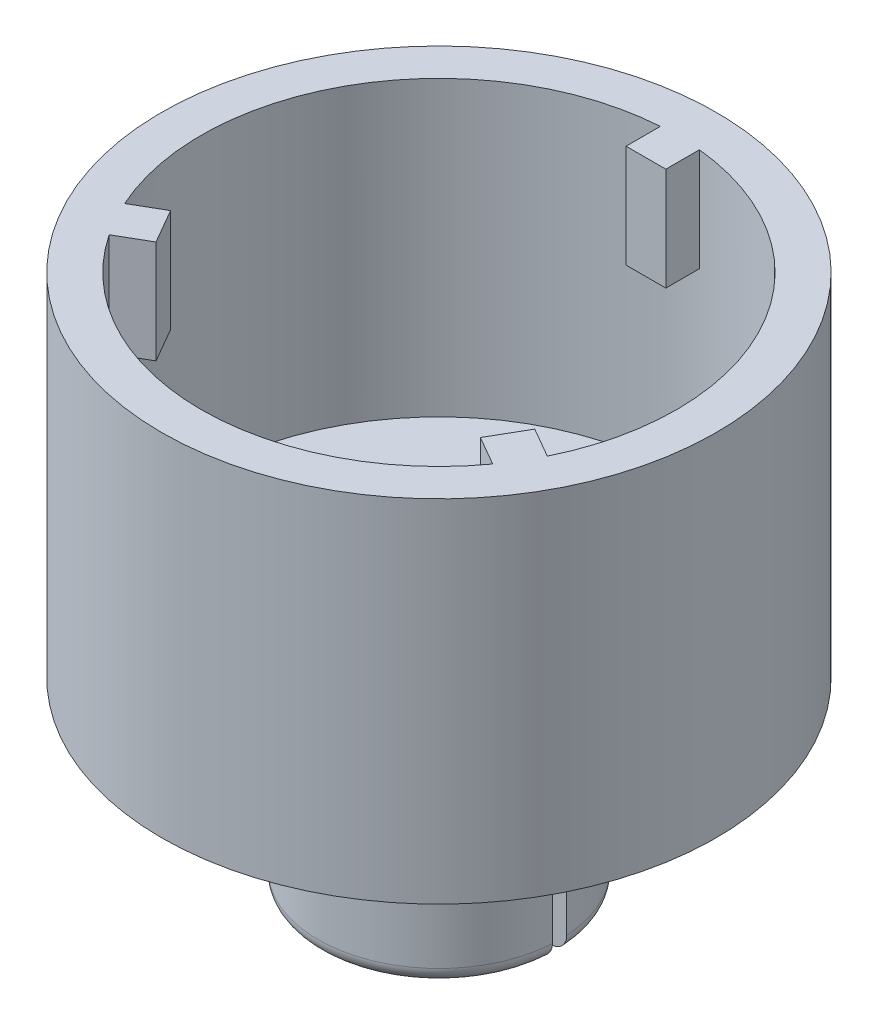
ISO-10303-21;
HEADER;
FILE_DESCRIPTION(('STEP AP214'),'2;1');
FILE_NAME('part.step','',(''),(''),'','','');
FILE_SCHEMA(('AUTOMOTIVE_DESIGN { 1 0 10303 214 1 1 1 1 }'));
ENDSEC;
DATA;
#1=APPLICATION_CONTEXT('core data for automotive mechanical design processes');
#2=APPLICATION_PROTOCOL_DEFINITION('international standard','automotive_design',2000,#1);
#3=PRODUCT_CONTEXT('',#1,'mechanical');
#4=PRODUCT('Part','Part','',(#3));
#5=PRODUCT_RELATED_PRODUCT_CATEGORY('part','',(#4));
#6=PRODUCT_DEFINITION_FORMATION('','',#4);
#7=PRODUCT_DEFINITION_CONTEXT('part definition',#1,'design');
#8=PRODUCT_DEFINITION('design','',#6,#7);
#9=PRODUCT_DEFINITION_SHAPE('','',#8);
#10=(LENGTH_UNIT() NAMED_UNIT(*) SI_UNIT(.MILLI.,.METRE.));
#11=(NAMED_UNIT(*) PLANE_ANGLE_UNIT() SI_UNIT($,.RADIAN.));
#12=(NAMED_UNIT(*) SI_UNIT($,.STERADIAN.) SOLID_ANGLE_UNIT());
#13=UNCERTAINTY_MEASURE_WITH_UNIT(LENGTH_MEASURE(1.E-05),#10,'distance_accuracy_value','');
#14=(GEOMETRIC_REPRESENTATION_CONTEXT(3) GLOBAL_UNCERTAINTY_ASSIGNED_CONTEXT((#13)) GLOBAL_UNIT_ASSIGNED_CONTEXT((#10,
#11,#12)) REPRESENTATION_CONTEXT('',''));
#15=CARTESIAN_POINT('',(0.,0.,0.));
#16=DIRECTION('',(0.,0.,1.));
#17=DIRECTION('',(1.,0.,0.));
#18=AXIS2_PLACEMENT_3D('',#15,#16,#17);
#19=CARTESIAN_POINT('',(0.,-23.,0.));
#20=DIRECTION('',(0.,1.,0.));
#21=DIRECTION('',(0.,0.,1.));
#22=AXIS2_PLACEMENT_3D('',#19,#20,#21);
#23=CYLINDRICAL_SURFACE('',#22,15.25);
#24=DIRECTION('',(0.,1.,0.));
#25=VECTOR('',#24,1.);
#26=CARTESIAN_POINT('',(-15.2232202518428,-23.,0.903363251346434));
#27=LINE('',#26,#25);
#28=CARTESIAN_POINT('',(-15.2232202518428,-7.,0.903363251346434));
#29=VERTEX_POINT('',#28);
#30=CARTESIAN_POINT('',(-15.2232202518428,-21.,0.903363251346434));
#31=VERTEX_POINT('',#30);
#32=EDGE_CURVE('E285',#29,#31,#27,.F.);
#33=ORIENTED_EDGE('',*,*,#32,.T.);
#34=CARTESIAN_POINT('',(0.,-21.,0.));
#35=DIRECTION('',(0.,-1.,0.));
#36=DIRECTION('',(0.,0.,-1.));
#37=AXIS2_PLACEMENT_3D('',#34,#35,#36);
#38=CIRCLE('',#37,15.25);
#39=CARTESIAN_POINT('',(15.2232202518428,-21.,0.903363251346434));
#40=VERTEX_POINT('',#39);
#41=EDGE_CURVE('E275',#31,#40,#38,.F.);
#42=ORIENTED_EDGE('',*,*,#41,.T.);
#43=DIRECTION('',(0.,1.,0.));
#44=VECTOR('',#43,1.);
#45=CARTESIAN_POINT('',(15.2232202518428,-23.,0.903363251346434));
#46=LINE('',#45,#44);
#47=CARTESIAN_POINT('',(15.2232202518428,-7.,0.903363251346434));
#48=VERTEX_POINT('',#47);
#49=EDGE_CURVE('E292',#40,#48,#46,.T.);
#50=ORIENTED_EDGE('',*,*,#49,.T.);
#51=CARTESIAN_POINT('',(0.,-7.,0.));
#52=DIRECTION('',(0.,-1.,0.));
#53=DIRECTION('',(0.,0.,-1.));
#54=AXIS2_PLACEMENT_3D('',#51,#52,#53);
#55=CIRCLE('',#54,15.25);
#56=EDGE_CURVE('E179',#48,#29,#55,.T.);
#57=ORIENTED_EDGE('',*,*,#56,.T.);
#58=EDGE_LOOP('',(#33,#42,#50,#57));
#59=FACE_BOUND('',#58,.T.);
#60=ADVANCED_FACE('F39',(#59),#23,.T.);
#61=CARTESIAN_POINT('',(0.,-23.,0.));
#62=DIRECTION('',(0.,-1.,0.));
#63=DIRECTION('',(0.,0.,-1.));
#64=AXIS2_PLACEMENT_3D('',#61,#62,#63);
#65=PLANE('',#64);
#66=DIRECTION('',(-1.,0.,0.));
#67=VECTOR('',#66,1.);
#68=CARTESIAN_POINT('',(0.,-23.,0.903363251346434));
#69=LINE('',#68,#67);
#70=CARTESIAN_POINT('',(13.2191692188321,-23.,0.903363251346434));
#71=VERTEX_POINT('',#70);
#72=CARTESIAN_POINT('',(-13.2191692188321,-23.,0.903363251346434));
#73=VERTEX_POINT('',#72);
#74=EDGE_CURVE('E220',#71,#73,#69,.T.);
#75=ORIENTED_EDGE('',*,*,#74,.F.);
#76=CARTESIAN_POINT('',(0.,-23.,0.));
#77=DIRECTION('',(0.,-1.,0.));
#78=DIRECTION('',(0.,0.,-1.));
#79=AXIS2_PLACEMENT_3D('',#76,#77,#78);
#80=CIRCLE('',#79,13.25);
#81=EDGE_CURVE('E224',#71,#73,#80,.T.);
#82=ORIENTED_EDGE('',*,*,#81,.T.);
#83=EDGE_LOOP('',(#75,#82));
#84=FACE_BOUND('',#83,.T.);
#85=ADVANCED_FACE('F296',(#84),#65,.T.);
#86=CARTESIAN_POINT('',(0.,44.3,0.));
#87=DIRECTION('',(0.,-1.,0.));
#88=DIRECTION('',(0.,0.,-1.));
#89=AXIS2_PLACEMENT_3D('',#86,#87,#88);
#90=CYLINDRICAL_SURFACE('',#89,35.);
#91=CARTESIAN_POINT('',(0.,44.3,0.));
#92=DIRECTION('',(0.,1.,0.));
#93=DIRECTION('',(0.,0.,1.));
#94=AXIS2_PLACEMENT_3D('',#91,#92,#93);
#95=CIRCLE('',#94,35.);
#96=CARTESIAN_POINT('',(0.,44.3,35.));
#97=VERTEX_POINT('',#96);
#98=EDGE_CURVE('E180',#97,#97,#95,.T.);
#99=ORIENTED_EDGE('',*,*,#98,.F.);
#100=EDGE_LOOP('',(#99));
#101=FACE_BOUND('',#100,.T.);
#102=CARTESIAN_POINT('',(0.,0.,0.));
#103=DIRECTION('',(0.,1.,0.));
#104=DIRECTION('',(0.,0.,1.));
#105=AXIS2_PLACEMENT_3D('',#102,#103,#104);
#106=CIRCLE('',#105,35.);
#107=CARTESIAN_POINT('',(0.,0.,35.));
#108=VERTEX_POINT('',#107);
#109=EDGE_CURVE('E187',#108,#108,#106,.T.);
#110=ORIENTED_EDGE('',*,*,#109,.T.);
#111=EDGE_LOOP('',(#110));
#112=FACE_BOUND('',#111,.T.);
#113=ADVANCED_FACE('F298',(#101,#112),#90,.T.);
#114=CARTESIAN_POINT('',(0.,44.3,0.));
#115=DIRECTION('',(0.,1.,0.));
#116=DIRECTION('',(0.,0.,1.));
#117=AXIS2_PLACEMENT_3D('',#114,#115,#116);
#118=PLANE('',#117);
#119=CARTESIAN_POINT('',(0.,44.3,0.));
#120=DIRECTION('',(0.,1.,0.));
#121=DIRECTION('',(0.,0.,1.));
#122=AXIS2_PLACEMENT_3D('',#119,#120,#121);
#123=CIRCLE('',#122,30.);
#124=CARTESIAN_POINT('',(-1.99053412286535,44.3,-29.933890056351));
#125=VERTEX_POINT('',#124);
#126=CARTESIAN_POINT('',(-27.3630036166739,44.3,12.2990256961229));
#127=VERTEX_POINT('',#126);
#128=EDGE_CURVE('E203',#125,#127,#123,.T.);
#129=ORIENTED_EDGE('',*,*,#128,.F.);
#130=DIRECTION('',(0.,0.,1.));
#131=VECTOR('',#130,1.);
#132=CARTESIAN_POINT('',(-1.99053412286535,44.3,-29.933890056351));
#133=LINE('',#132,#131);
#134=CARTESIAN_POINT('',(-1.99053412286506,44.3,-25.6053170757624));
#135=VERTEX_POINT('',#134);
#136=EDGE_CURVE('E636',#125,#135,#133,.T.);
#137=ORIENTED_EDGE('',*,*,#136,.T.);
#138=DIRECTION('',(1.,0.,0.));
#139=VECTOR('',#138,1.);
#140=CARTESIAN_POINT('',(-1.99053412286506,44.3,-25.6053170757624));
#141=LINE('',#140,#139);
#142=CARTESIAN_POINT('',(3.03023311369694,44.3,-25.6053170757624));
#143=VERTEX_POINT('',#142);
#144=EDGE_CURVE('E665',#135,#143,#141,.T.);
#145=ORIENTED_EDGE('',*,*,#144,.T.);
#146=DIRECTION('',(0.,0.,-1.));
#147=VECTOR('',#146,1.);
#148=CARTESIAN_POINT('',(3.03023311369694,44.3,-25.6053170757624));
#149=LINE('',#148,#147);
#150=CARTESIAN_POINT('',(3.03023311369666,44.3,-29.8465691039465));
#151=VERTEX_POINT('',#150);
#152=EDGE_CURVE('E650',#143,#151,#149,.T.);
#153=ORIENTED_EDGE('',*,*,#152,.T.);
#154=CARTESIAN_POINT('',(26.918776284323,44.3,13.2430919106745));
#155=VERTEX_POINT('',#154);
#156=EDGE_CURVE('E197',#155,#151,#123,.T.);
#157=ORIENTED_EDGE('',*,*,#156,.F.);
#158=DIRECTION('',(-0.866025403784455,0.,-0.499999999999972));
#159=VECTOR('',#158,1.);
#160=CARTESIAN_POINT('',(26.918776284323,44.3,13.2430919106745));
#161=LINE('',#160,#159);
#162=CARTESIAN_POINT('',(23.1701221209983,44.3,11.0788054203803));
#163=VERTEX_POINT('',#162);
#164=EDGE_CURVE('E595',#155,#163,#161,.T.);
#165=ORIENTED_EDGE('',*,*,#164,.T.);
#166=DIRECTION('',(-0.500000000000001,0.,0.866025403784438));
#167=VECTOR('',#166,1.);
#168=CARTESIAN_POINT('',(23.1701221209983,44.3,11.0788054203803));
#169=LINE('',#168,#167);
#170=CARTESIAN_POINT('',(20.6597385027173,44.3,15.4269173937316));
#171=VERTEX_POINT('',#170);
#172=EDGE_CURVE('E625',#163,#171,#169,.T.);
#173=ORIENTED_EDGE('',*,*,#172,.T.);
#174=DIRECTION('',(0.866025403784455,0.,0.499999999999971));
#175=VECTOR('',#174,1.);
#176=CARTESIAN_POINT('',(20.6597385027173,44.3,15.4269173937316));
#177=LINE('',#176,#175);
#178=CARTESIAN_POINT('',(24.332770502977,44.3,17.5475434078235));
#179=VERTEX_POINT('',#178);
#180=EDGE_CURVE('E609',#171,#179,#177,.T.);
#181=ORIENTED_EDGE('',*,*,#180,.T.);
#182=CARTESIAN_POINT('',(-24.9282421614578,44.3,16.6907981456764));
#183=VERTEX_POINT('',#182);
#184=EDGE_CURVE('E205',#183,#179,#123,.T.);
#185=ORIENTED_EDGE('',*,*,#184,.F.);
#186=DIRECTION('',(0.866025403784443,0.,-0.499999999999992));
#187=VECTOR('',#186,1.);
#188=CARTESIAN_POINT('',(-24.9282421614578,44.3,16.6907981456764));
#189=LINE('',#188,#187);
#190=CARTESIAN_POINT('',(-21.1795879981326,44.3,14.5265116553818));
#191=VERTEX_POINT('',#190);
#192=EDGE_CURVE('E563',#183,#191,#189,.T.);
#193=ORIENTED_EDGE('',*,*,#192,.T.);
#194=DIRECTION('',(-0.500000000000112,0.,-0.866025403784374));
#195=VECTOR('',#194,1.);
#196=CARTESIAN_POINT('',(-21.1795879981326,44.3,14.5265116553818));
#197=LINE('',#196,#195);
#198=CARTESIAN_POINT('',(-23.6899716164142,44.3,10.1783996820308));
#199=VERTEX_POINT('',#198);
#200=EDGE_CURVE('E584',#191,#199,#197,.T.);
#201=ORIENTED_EDGE('',*,*,#200,.T.);
#202=DIRECTION('',(-0.866025403784438,0.,0.5));
#203=VECTOR('',#202,1.);
#204=CARTESIAN_POINT('',(-23.6899716164142,44.3,10.1783996820308));
#205=LINE('',#204,#203);
#206=EDGE_CURVE('E568',#199,#127,#205,.T.);
#207=ORIENTED_EDGE('',*,*,#206,.T.);
#208=EDGE_LOOP('',(#129,#137,#145,#153,#157,#165,#173,#181,#185,#193,#201,#207));
#209=FACE_BOUND('',#208,.T.);
#210=ORIENTED_EDGE('',*,*,#98,.T.);
#211=EDGE_LOOP('',(#210));
#212=FACE_BOUND('',#211,.T.);
#213=ADVANCED_FACE('F305',(#209,#212),#118,.T.);
#214=CARTESIAN_POINT('',(0.,0.,0.));
#215=DIRECTION('',(0.,1.,0.));
#216=DIRECTION('',(0.,0.,1.));
#217=AXIS2_PLACEMENT_3D('',#214,#215,#216);
#218=PLANE('',#217);
#219=CARTESIAN_POINT('',(0.,0.,0.));
#220=DIRECTION('',(0.,1.,0.));
#221=DIRECTION('',(0.,0.,1.));
#222=AXIS2_PLACEMENT_3D('',#219,#220,#221);
#223=CIRCLE('',#222,24.5);
#224=CARTESIAN_POINT('',(0.,0.,24.5));
#225=VERTEX_POINT('',#224);
#226=EDGE_CURVE('E213',#225,#225,#223,.T.);
#227=ORIENTED_EDGE('',*,*,#226,.T.);
#228=EDGE_LOOP('',(#227));
#229=FACE_BOUND('',#228,.T.);
#230=ORIENTED_EDGE('',*,*,#109,.F.);
#231=EDGE_LOOP('',(#230));
#232=FACE_BOUND('',#231,.T.);
#233=ADVANCED_FACE('F438',(#229,#232),#218,.F.);
#234=CARTESIAN_POINT('',(0.,7.3,0.));
#235=DIRECTION('',(0.,1.,0.));
#236=DIRECTION('',(0.,0.,1.));
#237=AXIS2_PLACEMENT_3D('',#234,#235,#236);
#238=CYLINDRICAL_SURFACE('',#237,30.);
#239=ORIENTED_EDGE('',*,*,#128,.T.);
#240=DIRECTION('',(0.,1.,0.));
#241=VECTOR('',#240,1.);
#242=CARTESIAN_POINT('',(-27.3630036166739,31.3,12.2990256961229));
#243=LINE('',#242,#241);
#244=CARTESIAN_POINT('',(-27.3630036166739,31.3,12.2990256961229));
#245=VERTEX_POINT('',#244);
#246=EDGE_CURVE('E591',#245,#127,#243,.T.);
#247=ORIENTED_EDGE('',*,*,#246,.F.);
#248=CARTESIAN_POINT('',(0.,31.3,0.));
#249=DIRECTION('',(0.,1.,0.));
#250=DIRECTION('',(0.,0.,1.));
#251=AXIS2_PLACEMENT_3D('',#248,#249,#250);
#252=CIRCLE('',#251,30.);
#253=CARTESIAN_POINT('',(-24.9282421614578,31.3,16.6907981456764));
#254=VERTEX_POINT('',#253);
#255=EDGE_CURVE('E564',#245,#254,#252,.T.);
#256=ORIENTED_EDGE('',*,*,#255,.T.);
#257=DIRECTION('',(0.,1.,0.));
#258=VECTOR('',#257,1.);
#259=CARTESIAN_POINT('',(-24.9282421614578,31.3,16.6907981456764));
#260=LINE('',#259,#258);
#261=EDGE_CURVE('E580',#254,#183,#260,.T.);
#262=ORIENTED_EDGE('',*,*,#261,.T.);
#263=ORIENTED_EDGE('',*,*,#184,.T.);
#264=DIRECTION('',(0.,1.,0.));
#265=VECTOR('',#264,1.);
#266=CARTESIAN_POINT('',(24.332770502977,31.3,17.5475434078235));
#267=LINE('',#266,#265);
#268=CARTESIAN_POINT('',(24.332770502977,31.3,17.5475434078235));
#269=VERTEX_POINT('',#268);
#270=EDGE_CURVE('E632',#269,#179,#267,.T.);
#271=ORIENTED_EDGE('',*,*,#270,.F.);
#272=CARTESIAN_POINT('',(0.,31.3,0.));
#273=DIRECTION('',(0.,1.,0.));
#274=DIRECTION('',(0.,0.,1.));
#275=AXIS2_PLACEMENT_3D('',#272,#273,#274);
#276=CIRCLE('',#275,30.);
#277=CARTESIAN_POINT('',(26.918776284323,31.3,13.2430919106745));
#278=VERTEX_POINT('',#277);
#279=EDGE_CURVE('E605',#269,#278,#276,.T.);
#280=ORIENTED_EDGE('',*,*,#279,.T.);
#281=DIRECTION('',(0.,1.,0.));
#282=VECTOR('',#281,1.);
#283=CARTESIAN_POINT('',(26.918776284323,31.3,13.2430919106745));
#284=LINE('',#283,#282);
#285=EDGE_CURVE('E621',#278,#155,#284,.T.);
#286=ORIENTED_EDGE('',*,*,#285,.T.);
#287=ORIENTED_EDGE('',*,*,#156,.T.);
#288=DIRECTION('',(0.,1.,0.));
#289=VECTOR('',#288,1.);
#290=CARTESIAN_POINT('',(3.03023311369666,31.3,-29.8465691039465));
#291=LINE('',#290,#289);
#292=CARTESIAN_POINT('',(3.03023311369666,31.3,-29.8465691039465));
#293=VERTEX_POINT('',#292);
#294=EDGE_CURVE('E198',#293,#151,#291,.T.);
#295=ORIENTED_EDGE('',*,*,#294,.F.);
#296=CARTESIAN_POINT('',(0.,31.3,0.));
#297=DIRECTION('',(0.,1.,0.));
#298=DIRECTION('',(0.,0.,1.));
#299=AXIS2_PLACEMENT_3D('',#296,#297,#298);
#300=CIRCLE('',#299,30.);
#301=CARTESIAN_POINT('',(-1.99053412286535,31.3,-29.933890056351));
#302=VERTEX_POINT('',#301);
#303=EDGE_CURVE('E646',#293,#302,#300,.T.);
#304=ORIENTED_EDGE('',*,*,#303,.T.);
#305=DIRECTION('',(0.,1.,0.));
#306=VECTOR('',#305,1.);
#307=CARTESIAN_POINT('',(-1.99053412286535,31.3,-29.933890056351));
#308=LINE('',#307,#306);
#309=EDGE_CURVE('E191',#302,#125,#308,.T.);
#310=ORIENTED_EDGE('',*,*,#309,.T.);
#311=EDGE_LOOP('',(#239,#247,#256,#262,#263,#271,#280,#286,#287,#295,#304,#310));
#312=FACE_BOUND('',#311,.T.);
#313=CARTESIAN_POINT('',(0.,7.3,0.));
#314=DIRECTION('',(0.,1.,0.));
#315=DIRECTION('',(0.,0.,1.));
#316=AXIS2_PLACEMENT_3D('',#313,#314,#315);
#317=CIRCLE('',#316,30.);
#318=CARTESIAN_POINT('',(0.,7.3,30.));
#319=VERTEX_POINT('',#318);
#320=EDGE_CURVE('E199',#319,#319,#317,.T.);
#321=ORIENTED_EDGE('',*,*,#320,.F.);
#322=EDGE_LOOP('',(#321));
#323=FACE_BOUND('',#322,.T.);
#324=ADVANCED_FACE('F452',(#312,#323),#238,.F.);
#325=CARTESIAN_POINT('',(0.,7.3,0.));
#326=DIRECTION('',(0.,1.,0.));
#327=DIRECTION('',(0.,0.,1.));
#328=AXIS2_PLACEMENT_3D('',#325,#326,#327);
#329=PLANE('',#328);
#330=ORIENTED_EDGE('',*,*,#320,.T.);
#331=EDGE_LOOP('',(#330));
#332=FACE_BOUND('',#331,.T.);
#333=ADVANCED_FACE('F456',(#332),#329,.T.);
#334=CARTESIAN_POINT('',(0.,-7.,0.));
#335=DIRECTION('',(0.,1.,0.));
#336=DIRECTION('',(0.,0.,1.));
#337=AXIS2_PLACEMENT_3D('',#334,#335,#336);
#338=CYLINDRICAL_SURFACE('',#337,19.5);
#339=CARTESIAN_POINT('',(0.,-5.,0.));
#340=DIRECTION('',(0.,1.,0.));
#341=DIRECTION('',(0.,0.,1.));
#342=AXIS2_PLACEMENT_3D('',#339,#340,#341);
#343=CIRCLE('',#342,19.5);
#344=CARTESIAN_POINT('',(0.,-5.,19.5));
#345=VERTEX_POINT('',#344);
#346=EDGE_CURVE('E185',#345,#345,#343,.F.);
#347=ORIENTED_EDGE('',*,*,#346,.T.);
#348=EDGE_LOOP('',(#347));
#349=FACE_BOUND('',#348,.T.);
#350=CARTESIAN_POINT('',(0.,-7.,0.));
#351=DIRECTION('',(0.,-1.,0.));
#352=DIRECTION('',(0.,0.,-1.));
#353=AXIS2_PLACEMENT_3D('',#350,#351,#352);
#354=CIRCLE('',#353,19.5);
#355=CARTESIAN_POINT('',(0.,-7.,-19.5));
#356=VERTEX_POINT('',#355);
#357=EDGE_CURVE('E193',#356,#356,#354,.T.);
#358=ORIENTED_EDGE('',*,*,#357,.F.);
#359=EDGE_LOOP('',(#358));
#360=FACE_BOUND('',#359,.T.);
#361=ADVANCED_FACE('F467',(#349,#360),#338,.T.);
#362=CARTESIAN_POINT('',(0.,-7.,0.));
#363=DIRECTION('',(0.,-1.,0.));
#364=DIRECTION('',(0.,0.,-1.));
#365=AXIS2_PLACEMENT_3D('',#362,#363,#364);
#366=PLANE('',#365);
#367=ORIENTED_EDGE('',*,*,#56,.F.);
#368=DIRECTION('',(1.,0.,0.));
#369=VECTOR('',#368,1.);
#370=CARTESIAN_POINT('',(33.0968426441505,-7.,0.903363251346434));
#371=LINE('',#370,#369);
#372=EDGE_CURVE('E175',#29,#48,#371,.T.);
#373=ORIENTED_EDGE('',*,*,#372,.F.);
#374=EDGE_LOOP('',(#367,#373));
#375=FACE_BOUND('',#374,.T.);
#376=CARTESIAN_POINT('',(-15.2232202518428,-7.,-0.903363251346434));
#377=VERTEX_POINT('',#376);
#378=CARTESIAN_POINT('',(15.2232202518428,-7.,-0.903363251346434));
#379=VERTEX_POINT('',#378);
#380=EDGE_CURVE('E173',#377,#379,#55,.T.);
#381=ORIENTED_EDGE('',*,*,#380,.F.);
#382=DIRECTION('',(-1.,0.,0.));
#383=VECTOR('',#382,1.);
#384=CARTESIAN_POINT('',(33.0968426441505,-7.,-0.903363251346434));
#385=LINE('',#384,#383);
#386=EDGE_CURVE('E164',#379,#377,#385,.T.);
#387=ORIENTED_EDGE('',*,*,#386,.F.);
#388=EDGE_LOOP('',(#381,#387));
#389=FACE_BOUND('',#388,.T.);
#390=ORIENTED_EDGE('',*,*,#357,.T.);
#391=EDGE_LOOP('',(#390));
#392=FACE_BOUND('',#391,.T.);
#393=ADVANCED_FACE('F171',(#375,#389,#392),#366,.T.);
#394=DIRECTION('',(0.,1.,0.));
#395=VECTOR('',#394,1.);
#396=CARTESIAN_POINT('',(15.2232202518428,-23.,-0.903363251346434));
#397=LINE('',#396,#395);
#398=CARTESIAN_POINT('',(15.2232202518428,-21.,-0.903363251346434));
#399=VERTEX_POINT('',#398);
#400=EDGE_CURVE('E161',#379,#399,#397,.F.);
#401=ORIENTED_EDGE('',*,*,#400,.T.);
#402=CARTESIAN_POINT('',(0.,-21.,0.));
#403=DIRECTION('',(0.,-1.,0.));
#404=DIRECTION('',(0.,0.,-1.));
#405=AXIS2_PLACEMENT_3D('',#402,#403,#404);
#406=CIRCLE('',#405,15.25);
#407=CARTESIAN_POINT('',(-15.2232202518428,-21.,-0.903363251346434));
#408=VERTEX_POINT('',#407);
#409=EDGE_CURVE('E11',#399,#408,#406,.F.);
#410=ORIENTED_EDGE('',*,*,#409,.T.);
#411=DIRECTION('',(0.,1.,0.));
#412=VECTOR('',#411,1.);
#413=CARTESIAN_POINT('',(-15.2232202518428,-23.,-0.903363251346434));
#414=LINE('',#413,#412);
#415=EDGE_CURVE('E168',#408,#377,#414,.T.);
#416=ORIENTED_EDGE('',*,*,#415,.T.);
#417=ORIENTED_EDGE('',*,*,#380,.T.);
#418=EDGE_LOOP('',(#401,#410,#416,#417));
#419=FACE_BOUND('',#418,.T.);
#420=ADVANCED_FACE('F177',(#419),#23,.T.);
#421=DIRECTION('',(1.,0.,0.));
#422=VECTOR('',#421,1.);
#423=CARTESIAN_POINT('',(0.,-23.,-0.903363251346434));
#424=LINE('',#423,#422);
#425=CARTESIAN_POINT('',(-13.2191692188321,-23.,-0.903363251346434));
#426=VERTEX_POINT('',#425);
#427=CARTESIAN_POINT('',(13.2191692188321,-23.,-0.903363251346434));
#428=VERTEX_POINT('',#427);
#429=EDGE_CURVE('E217',#426,#428,#424,.T.);
#430=ORIENTED_EDGE('',*,*,#429,.F.);
#431=CARTESIAN_POINT('',(0.,-23.,0.));
#432=DIRECTION('',(0.,-1.,0.));
#433=DIRECTION('',(0.,0.,-1.));
#434=AXIS2_PLACEMENT_3D('',#431,#432,#433);
#435=CIRCLE('',#434,13.25);
#436=EDGE_CURVE('E270',#426,#428,#435,.T.);
#437=ORIENTED_EDGE('',*,*,#436,.T.);
#438=EDGE_LOOP('',(#430,#437));
#439=FACE_BOUND('',#438,.T.);
#440=ADVANCED_FACE('F300',(#439),#65,.T.);
#441=CARTESIAN_POINT('',(0.,-5.,0.));
#442=DIRECTION('',(0.,1.,0.));
#443=DIRECTION('',(0.,0.,1.));
#444=AXIS2_PLACEMENT_3D('',#441,#442,#443);
#445=TOROIDAL_SURFACE('',#444,24.5,5.);
#446=ORIENTED_EDGE('',*,*,#226,.F.);
#447=EDGE_LOOP('',(#446));
#448=FACE_BOUND('',#447,.T.);
#449=ORIENTED_EDGE('',*,*,#346,.F.);
#450=EDGE_LOOP('',(#449));
#451=FACE_BOUND('',#450,.T.);
#452=ADVANCED_FACE('F311',(#448,#451),#445,.F.);
#453=CARTESIAN_POINT('',(3.03023311369694,31.3,-25.6053170757624));
#454=DIRECTION('',(1.,0.,0.));
#455=DIRECTION('',(0.,0.,-1.));
#456=AXIS2_PLACEMENT_3D('',#453,#454,#455);
#457=PLANE('',#456);
#458=ORIENTED_EDGE('',*,*,#152,.F.);
#459=DIRECTION('',(0.,1.,0.));
#460=VECTOR('',#459,1.);
#461=CARTESIAN_POINT('',(3.03023311369694,31.3,-25.6053170757624));
#462=LINE('',#461,#460);
#463=CARTESIAN_POINT('',(3.03023311369694,31.3,-25.6053170757624));
#464=VERTEX_POINT('',#463);
#465=EDGE_CURVE('E675',#464,#143,#462,.T.);
#466=ORIENTED_EDGE('',*,*,#465,.F.);
#467=DIRECTION('',(0.,0.,-1.));
#468=VECTOR('',#467,1.);
#469=CARTESIAN_POINT('',(3.03023311369694,31.3,-25.6053170757624));
#470=LINE('',#469,#468);
#471=EDGE_CURVE('E658',#464,#293,#470,.T.);
#472=ORIENTED_EDGE('',*,*,#471,.T.);
#473=ORIENTED_EDGE('',*,*,#294,.T.);
#474=EDGE_LOOP('',(#458,#466,#472,#473));
#475=FACE_BOUND('',#474,.T.);
#476=ADVANCED_FACE('F316',(#475),#457,.T.);
#477=CARTESIAN_POINT('',(-1.99053412286506,31.3,-25.6053170757624));
#478=DIRECTION('',(0.,0.,1.));
#479=DIRECTION('',(1.,0.,0.));
#480=AXIS2_PLACEMENT_3D('',#477,#478,#479);
#481=PLANE('',#480);
#482=ORIENTED_EDGE('',*,*,#144,.F.);
#483=DIRECTION('',(0.,1.,0.));
#484=VECTOR('',#483,1.);
#485=CARTESIAN_POINT('',(-1.99053412286506,31.3,-25.6053170757624));
#486=LINE('',#485,#484);
#487=CARTESIAN_POINT('',(-1.99053412286506,31.3,-25.6053170757624));
#488=VERTEX_POINT('',#487);
#489=EDGE_CURVE('E677',#488,#135,#486,.T.);
#490=ORIENTED_EDGE('',*,*,#489,.F.);
#491=DIRECTION('',(1.,0.,0.));
#492=VECTOR('',#491,1.);
#493=CARTESIAN_POINT('',(-1.99053412286506,31.3,-25.6053170757624));
#494=LINE('',#493,#492);
#495=EDGE_CURVE('E654',#488,#464,#494,.T.);
#496=ORIENTED_EDGE('',*,*,#495,.T.);
#497=ORIENTED_EDGE('',*,*,#465,.T.);
#498=EDGE_LOOP('',(#482,#490,#496,#497));
#499=FACE_BOUND('',#498,.T.);
#500=ADVANCED_FACE('F410',(#499),#481,.T.);
#501=CARTESIAN_POINT('',(-1.99053412286535,31.3,-29.933890056351));
#502=DIRECTION('',(-1.,0.,0.));
#503=DIRECTION('',(0.,0.,1.));
#504=AXIS2_PLACEMENT_3D('',#501,#502,#503);
#505=PLANE('',#504);
#506=ORIENTED_EDGE('',*,*,#136,.F.);
#507=ORIENTED_EDGE('',*,*,#309,.F.);
#508=DIRECTION('',(0.,0.,1.));
#509=VECTOR('',#508,1.);
#510=CARTESIAN_POINT('',(-1.99053412286535,31.3,-29.933890056351));
#511=LINE('',#510,#509);
#512=EDGE_CURVE('E649',#302,#488,#511,.T.);
#513=ORIENTED_EDGE('',*,*,#512,.T.);
#514=ORIENTED_EDGE('',*,*,#489,.T.);
#515=EDGE_LOOP('',(#506,#507,#513,#514));
#516=FACE_BOUND('',#515,.T.);
#517=ADVANCED_FACE('F402',(#516),#505,.T.);
#518=CARTESIAN_POINT('',(0.,31.3,0.));
#519=DIRECTION('',(0.,1.,0.));
#520=DIRECTION('',(0.,0.,1.));
#521=AXIS2_PLACEMENT_3D('',#518,#519,#520);
#522=PLANE('',#521);
#523=ORIENTED_EDGE('',*,*,#303,.F.);
#524=ORIENTED_EDGE('',*,*,#471,.F.);
#525=ORIENTED_EDGE('',*,*,#495,.F.);
#526=ORIENTED_EDGE('',*,*,#512,.F.);
#527=EDGE_LOOP('',(#523,#524,#525,#526));
#528=FACE_BOUND('',#527,.T.);
#529=ADVANCED_FACE('F394',(#528),#522,.F.);
#530=CARTESIAN_POINT('',(20.6597385027173,31.3,15.4269173937316));
#531=DIRECTION('',(-0.499999999999971,0.,0.866025403784455));
#532=DIRECTION('',(0.866025403784455,0.,0.499999999999971));
#533=AXIS2_PLACEMENT_3D('',#530,#531,#532);
#534=PLANE('',#533);
#535=ORIENTED_EDGE('',*,*,#180,.F.);
#536=DIRECTION('',(0.,1.,0.));
#537=VECTOR('',#536,1.);
#538=CARTESIAN_POINT('',(20.6597385027173,31.3,15.4269173937316));
#539=LINE('',#538,#537);
#540=CARTESIAN_POINT('',(20.6597385027173,31.3,15.4269173937316));
#541=VERTEX_POINT('',#540);
#542=EDGE_CURVE('E637',#541,#171,#539,.T.);
#543=ORIENTED_EDGE('',*,*,#542,.F.);
#544=DIRECTION('',(0.866025403784455,0.,0.499999999999971));
#545=VECTOR('',#544,1.);
#546=CARTESIAN_POINT('',(20.6597385027173,31.3,15.4269173937316));
#547=LINE('',#546,#545);
#548=EDGE_CURVE('E617',#541,#269,#547,.T.);
#549=ORIENTED_EDGE('',*,*,#548,.T.);
#550=ORIENTED_EDGE('',*,*,#270,.T.);
#551=EDGE_LOOP('',(#535,#543,#549,#550));
#552=FACE_BOUND('',#551,.T.);
#553=ADVANCED_FACE('F386',(#552),#534,.T.);
#554=CARTESIAN_POINT('',(23.1701221209983,31.3,11.0788054203803));
#555=DIRECTION('',(-0.866025403784438,0.,-0.500000000000001));
#556=DIRECTION('',(-0.500000000000001,0.,0.866025403784438));
#557=AXIS2_PLACEMENT_3D('',#554,#555,#556);
#558=PLANE('',#557);
#559=ORIENTED_EDGE('',*,*,#172,.F.);
#560=DIRECTION('',(0.,1.,0.));
#561=VECTOR('',#560,1.);
#562=CARTESIAN_POINT('',(23.1701221209983,31.3,11.0788054203803));
#563=LINE('',#562,#561);
#564=CARTESIAN_POINT('',(23.1701221209983,31.3,11.0788054203803));
#565=VERTEX_POINT('',#564);
#566=EDGE_CURVE('E640',#565,#163,#563,.T.);
#567=ORIENTED_EDGE('',*,*,#566,.F.);
#568=DIRECTION('',(-0.500000000000001,0.,0.866025403784438));
#569=VECTOR('',#568,1.);
#570=CARTESIAN_POINT('',(23.1701221209983,31.3,11.0788054203803));
#571=LINE('',#570,#569);
#572=EDGE_CURVE('E613',#565,#541,#571,.T.);
#573=ORIENTED_EDGE('',*,*,#572,.T.);
#574=ORIENTED_EDGE('',*,*,#542,.T.);
#575=EDGE_LOOP('',(#559,#567,#573,#574));
#576=FACE_BOUND('',#575,.T.);
#577=ADVANCED_FACE('F378',(#576),#558,.T.);
#578=CARTESIAN_POINT('',(26.918776284323,31.3,13.2430919106745));
#579=DIRECTION('',(0.499999999999972,0.,-0.866025403784455));
#580=DIRECTION('',(-0.866025403784455,0.,-0.499999999999972));
#581=AXIS2_PLACEMENT_3D('',#578,#579,#580);
#582=PLANE('',#581);
#583=ORIENTED_EDGE('',*,*,#164,.F.);
#584=ORIENTED_EDGE('',*,*,#285,.F.);
#585=DIRECTION('',(-0.866025403784455,0.,-0.499999999999972));
#586=VECTOR('',#585,1.);
#587=CARTESIAN_POINT('',(26.918776284323,31.3,13.2430919106745));
#588=LINE('',#587,#586);
#589=EDGE_CURVE('E608',#278,#565,#588,.T.);
#590=ORIENTED_EDGE('',*,*,#589,.T.);
#591=ORIENTED_EDGE('',*,*,#566,.T.);
#592=EDGE_LOOP('',(#583,#584,#590,#591));
#593=FACE_BOUND('',#592,.T.);
#594=ADVANCED_FACE('F370',(#593),#582,.T.);
#595=CARTESIAN_POINT('',(0.,31.3,0.));
#596=DIRECTION('',(0.,1.,0.));
#597=DIRECTION('',(0.,0.,1.));
#598=AXIS2_PLACEMENT_3D('',#595,#596,#597);
#599=PLANE('',#598);
#600=ORIENTED_EDGE('',*,*,#279,.F.);
#601=ORIENTED_EDGE('',*,*,#548,.F.);
#602=ORIENTED_EDGE('',*,*,#572,.F.);
#603=ORIENTED_EDGE('',*,*,#589,.F.);
#604=EDGE_LOOP('',(#600,#601,#602,#603));
#605=FACE_BOUND('',#604,.T.);
#606=ADVANCED_FACE('F363',(#605),#599,.F.);
#607=CARTESIAN_POINT('',(-23.6899716164142,31.3,10.1783996820308));
#608=DIRECTION('',(-0.5,0.,-0.866025403784439));
#609=DIRECTION('',(-0.866025403784439,0.,0.5));
#610=AXIS2_PLACEMENT_3D('',#607,#608,#609);
#611=PLANE('',#610);
#612=ORIENTED_EDGE('',*,*,#206,.F.);
#613=DIRECTION('',(0.,1.,0.));
#614=VECTOR('',#613,1.);
#615=CARTESIAN_POINT('',(-23.6899716164142,31.3,10.1783996820308));
#616=LINE('',#615,#614);
#617=CARTESIAN_POINT('',(-23.6899716164142,31.3,10.1783996820308));
#618=VERTEX_POINT('',#617);
#619=EDGE_CURVE('E596',#618,#199,#616,.T.);
#620=ORIENTED_EDGE('',*,*,#619,.F.);
#621=DIRECTION('',(-0.866025403784438,0.,0.5));
#622=VECTOR('',#621,1.);
#623=CARTESIAN_POINT('',(-23.6899716164142,31.3,10.1783996820308));
#624=LINE('',#623,#622);
#625=EDGE_CURVE('E576',#618,#245,#624,.T.);
#626=ORIENTED_EDGE('',*,*,#625,.T.);
#627=ORIENTED_EDGE('',*,*,#246,.T.);
#628=EDGE_LOOP('',(#612,#620,#626,#627));
#629=FACE_BOUND('',#628,.T.);
#630=ADVANCED_FACE('F355',(#629),#611,.T.);
#631=CARTESIAN_POINT('',(-21.1795879981326,31.3,14.5265116553818));
#632=DIRECTION('',(0.866025403784374,0.,-0.500000000000112));
#633=DIRECTION('',(-0.500000000000112,0.,-0.866025403784374));
#634=AXIS2_PLACEMENT_3D('',#631,#632,#633);
#635=PLANE('',#634);
#636=ORIENTED_EDGE('',*,*,#200,.F.);
#637=DIRECTION('',(0.,1.,0.));
#638=VECTOR('',#637,1.);
#639=CARTESIAN_POINT('',(-21.1795879981326,31.3,14.5265116553818));
#640=LINE('',#639,#638);
#641=CARTESIAN_POINT('',(-21.1795879981326,31.3,14.5265116553818));
#642=VERTEX_POINT('',#641);
#643=EDGE_CURVE('E599',#642,#191,#640,.T.);
#644=ORIENTED_EDGE('',*,*,#643,.F.);
#645=DIRECTION('',(-0.500000000000112,0.,-0.866025403784374));
#646=VECTOR('',#645,1.);
#647=CARTESIAN_POINT('',(-21.1795879981326,31.3,14.5265116553818));
#648=LINE('',#647,#646);
#649=EDGE_CURVE('E572',#642,#618,#648,.T.);
#650=ORIENTED_EDGE('',*,*,#649,.T.);
#651=ORIENTED_EDGE('',*,*,#619,.T.);
#652=EDGE_LOOP('',(#636,#644,#650,#651));
#653=FACE_BOUND('',#652,.T.);
#654=ADVANCED_FACE('F347',(#653),#635,.T.);
#655=CARTESIAN_POINT('',(-24.9282421614578,31.3,16.6907981456764));
#656=DIRECTION('',(0.499999999999992,0.,0.866025403784443));
#657=DIRECTION('',(0.866025403784443,0.,-0.499999999999992));
#658=AXIS2_PLACEMENT_3D('',#655,#656,#657);
#659=PLANE('',#658);
#660=ORIENTED_EDGE('',*,*,#192,.F.);
#661=ORIENTED_EDGE('',*,*,#261,.F.);
#662=DIRECTION('',(0.866025403784443,0.,-0.499999999999992));
#663=VECTOR('',#662,1.);
#664=CARTESIAN_POINT('',(-24.9282421614578,31.3,16.6907981456764));
#665=LINE('',#664,#663);
#666=EDGE_CURVE('E567',#254,#642,#665,.T.);
#667=ORIENTED_EDGE('',*,*,#666,.T.);
#668=ORIENTED_EDGE('',*,*,#643,.T.);
#669=EDGE_LOOP('',(#660,#661,#667,#668));
#670=FACE_BOUND('',#669,.T.);
#671=ADVANCED_FACE('F339',(#670),#659,.T.);
#672=CARTESIAN_POINT('',(0.,31.3,0.));
#673=DIRECTION('',(0.,1.,0.));
#674=DIRECTION('',(0.,0.,1.));
#675=AXIS2_PLACEMENT_3D('',#672,#673,#674);
#676=PLANE('',#675);
#677=ORIENTED_EDGE('',*,*,#255,.F.);
#678=ORIENTED_EDGE('',*,*,#625,.F.);
#679=ORIENTED_EDGE('',*,*,#649,.F.);
#680=ORIENTED_EDGE('',*,*,#666,.F.);
#681=EDGE_LOOP('',(#677,#678,#679,#680));
#682=FACE_BOUND('',#681,.T.);
#683=ADVANCED_FACE('F249',(#682),#676,.F.);
#684=CARTESIAN_POINT('',(33.0968426441505,59.2183375863677,0.903363251346434));
#685=DIRECTION('',(0.,0.,1.));
#686=DIRECTION('',(1.,0.,0.));
#687=AXIS2_PLACEMENT_3D('',#684,#685,#686);
#688=PLANE('',#687);
#689=ORIENTED_EDGE('',*,*,#74,.T.);
#690=CARTESIAN_POINT('',(-13.2191692188321,-23.,0.903363251346434));
#691=CARTESIAN_POINT('',(-13.2756424415771,-22.9999995609033,0.903363251346434));
#692=CARTESIAN_POINT('',(-13.3320887054836,-22.9976177069956,0.903363251346434));
#693=CARTESIAN_POINT('',(-13.444578403289,-22.9881142320961,0.903363251346434));
#694=CARTESIAN_POINT('',(-13.5006218535148,-22.9809928043156,0.903363251346434));
#695=CARTESIAN_POINT('',(-13.6674559687125,-22.9525833628222,0.903363251346434));
#696=CARTESIAN_POINT('',(-13.777130720685,-22.924250021228,0.903363251346434));
#697=CARTESIAN_POINT('',(-13.990165743797,-22.8495662000696,0.903363251346434));
#698=CARTESIAN_POINT('',(-14.0935227313194,-22.8032064419995,0.903363251346434));
#699=CARTESIAN_POINT('',(-14.2909681297702,-22.6937771474923,0.903363251346434));
#700=CARTESIAN_POINT('',(-14.3850583874932,-22.6307109498138,0.903363251346434));
#701=CARTESIAN_POINT('',(-14.5611727518909,-22.4897357020745,0.903363251346434));
#702=CARTESIAN_POINT('',(-14.6432117380692,-22.4118452329068,0.903363251346434));
#703=CARTESIAN_POINT('',(-14.7930355008666,-22.2433537734592,0.903363251346434));
#704=CARTESIAN_POINT('',(-14.8608175189015,-22.1527503289859,0.903363251346434));
#705=CARTESIAN_POINT('',(-14.9800524877207,-21.9616010447955,0.903363251346434));
#706=CARTESIAN_POINT('',(-15.0315336292775,-21.8610727685841,0.903363251346434));
#707=CARTESIAN_POINT('',(-15.1168307364638,-21.6528115741693,0.903363251346434));
#708=CARTESIAN_POINT('',(-15.1506575112983,-21.5450831101023,0.903363251346434));
#709=CARTESIAN_POINT('',(-15.1911452567023,-21.3638957315863,0.903363251346434));
#710=CARTESIAN_POINT('',(-15.203166194833,-21.2915894160377,0.903363251346434));
#711=CARTESIAN_POINT('',(-15.2192024915324,-21.1461989766328,0.903363251346434));
#712=CARTESIAN_POINT('',(-15.2232292335094,-21.073116107964,0.903363251346434));
#713=CARTESIAN_POINT('',(-15.2232202518428,-21.,0.903363251346434));
#714=B_SPLINE_CURVE_WITH_KNOTS('',3,(#690,#691,#692,#693,#694,#695,#696,#697,#698,#699,#700,
#701,#702,#703,#704,#705,#706,#707,#708,#709,#710,#711,#712,#713),.UNSPECIFIED.,.F.,.F.,(4,2,2,
2,2,2,2,2,2,2,2,4),(0.,0.169315847013464,0.33862479220124,0.67670859120119,1.01496663858033,
1.35315713649493,1.69092650183992,2.02876116226415,2.3660083385944,2.70304878629595,
2.92253432632545,3.14170710311557),.UNSPECIFIED.);
#715=EDGE_CURVE('E236',#73,#31,#714,.T.);
#716=ORIENTED_EDGE('',*,*,#715,.T.);
#717=ORIENTED_EDGE('',*,*,#32,.F.);
#718=ORIENTED_EDGE('',*,*,#372,.T.);
#719=ORIENTED_EDGE('',*,*,#49,.F.);
#720=CARTESIAN_POINT('',(15.2232202518428,-21.,0.903363251346434));
#721=CARTESIAN_POINT('',(15.2232199232489,-21.0561948021802,0.903363251346434));
#722=CARTESIAN_POINT('',(15.2208462010748,-21.1123626608613,0.903363251346434));
#723=CARTESIAN_POINT('',(15.211376767415,-21.2242959584954,0.903363251346434));
#724=CARTESIAN_POINT('',(15.2042812970132,-21.2800614178472,0.903363251346434));
#725=CARTESIAN_POINT('',(15.1759810982783,-21.4460523458939,0.903363251346434));
#726=CARTESIAN_POINT('',(15.1477623870815,-21.5551651452531,0.903363251346434));
#727=CARTESIAN_POINT('',(15.0734106566527,-21.7671001409726,0.903363251346434));
#728=CARTESIAN_POINT('',(15.0272693095068,-21.8699193872293,0.903363251346434));
#729=CARTESIAN_POINT('',(14.9183959883233,-22.0663574694,0.903363251346434));
#730=CARTESIAN_POINT('',(14.8556667286063,-22.1599778071192,0.903363251346434));
#731=CARTESIAN_POINT('',(14.7153560416617,-22.3354365581613,0.903363251346434));
#732=CARTESIAN_POINT('',(14.6377642041245,-22.4172666423318,0.903363251346434));
#733=CARTESIAN_POINT('',(14.469946451435,-22.5667823902729,0.903363251346434));
#734=CARTESIAN_POINT('',(14.3797180536156,-22.6344652680558,0.903363251346434));
#735=CARTESIAN_POINT('',(14.1890336936746,-22.7538779272838,0.903363251346434));
#736=CARTESIAN_POINT('',(14.0885588357039,-22.8055774991095,0.903363251346434));
#737=CARTESIAN_POINT('',(13.8803857068313,-22.8913863101094,0.903363251346434));
#738=CARTESIAN_POINT('',(13.7726914572009,-22.925505251361,0.903363251346434));
#739=CARTESIAN_POINT('',(13.5901629405491,-22.9668623444403,0.903363251346434));
#740=CARTESIAN_POINT('',(13.5164605185664,-22.9792819990314,0.903363251346434));
#741=CARTESIAN_POINT('',(13.368238510768,-22.9958498253569,0.903363251346434));
#742=CARTESIAN_POINT('',(13.2937202413688,-23.0000097771421,0.903363251346434));
#743=CARTESIAN_POINT('',(13.2191692188321,-23.,0.903363251346434));
#744=B_SPLINE_CURVE_WITH_KNOTS('',3,(#720,#721,#722,#723,#724,#725,#726,#727,#728,#729,#730,
#731,#732,#733,#734,#735,#736,#737,#738,#739,#740,#741,#742,#743),.UNSPECIFIED.,.F.,.F.,(4,2,2,
2,2,2,2,2,2,2,2,4),(0.,0.168480781633668,0.336952961602159,0.673326346007657,1.00985621666657,
1.34633105416501,1.68304243888204,2.01982006931767,2.35723039660949,2.69445432008634,
2.91824695183647,3.14172017891371),.UNSPECIFIED.);
#745=EDGE_CURVE('E228',#40,#71,#744,.T.);
#746=ORIENTED_EDGE('',*,*,#745,.T.);
#747=EDGE_LOOP('',(#689,#716,#717,#718,#719,#746));
#748=FACE_BOUND('',#747,.T.);
#749=ADVANCED_FACE('F245',(#748),#688,.F.);
#750=CARTESIAN_POINT('',(33.0968426441505,59.2183375863677,-0.903363251346434));
#751=DIRECTION('',(0.,0.,-1.));
#752=DIRECTION('',(-1.,0.,0.));
#753=AXIS2_PLACEMENT_3D('',#750,#751,#752);
#754=PLANE('',#753);
#755=ORIENTED_EDGE('',*,*,#429,.T.);
#756=CARTESIAN_POINT('',(13.2191692188321,-23.,-0.903363251346434));
#757=CARTESIAN_POINT('',(13.2756424415771,-22.9999995609033,-0.903363251346434));
#758=CARTESIAN_POINT('',(13.3320887054836,-22.9976177069956,-0.903363251346434));
#759=CARTESIAN_POINT('',(13.444578403289,-22.9881142320961,-0.903363251346434));
#760=CARTESIAN_POINT('',(13.5006218535148,-22.9809928043156,-0.903363251346434));
#761=CARTESIAN_POINT('',(13.6674559687125,-22.9525833628222,-0.903363251346434));
#762=CARTESIAN_POINT('',(13.777130720685,-22.924250021228,-0.903363251346434));
#763=CARTESIAN_POINT('',(13.990165743797,-22.8495662000696,-0.903363251346434));
#764=CARTESIAN_POINT('',(14.0935227313194,-22.8032064419995,-0.903363251346434));
#765=CARTESIAN_POINT('',(14.2909681297702,-22.6937771474923,-0.903363251346434));
#766=CARTESIAN_POINT('',(14.3850583874932,-22.6307109498138,-0.903363251346434));
#767=CARTESIAN_POINT('',(14.5611727518909,-22.4897357020745,-0.903363251346434));
#768=CARTESIAN_POINT('',(14.6432117380692,-22.4118452329068,-0.903363251346434));
#769=CARTESIAN_POINT('',(14.7930355008666,-22.2433537734592,-0.903363251346434));
#770=CARTESIAN_POINT('',(14.8608175189015,-22.1527503289859,-0.903363251346434));
#771=CARTESIAN_POINT('',(14.9800524877207,-21.9616010447955,-0.903363251346434));
#772=CARTESIAN_POINT('',(15.0315336292775,-21.8610727685841,-0.903363251346434));
#773=CARTESIAN_POINT('',(15.1168307364638,-21.6528115741693,-0.903363251346434));
#774=CARTESIAN_POINT('',(15.1506575112983,-21.5450831101023,-0.903363251346434));
#775=CARTESIAN_POINT('',(15.1911452567023,-21.3638957315863,-0.903363251346434));
#776=CARTESIAN_POINT('',(15.203166194833,-21.2915894160377,-0.903363251346434));
#777=CARTESIAN_POINT('',(15.2192024915324,-21.1461989766328,-0.903363251346434));
#778=CARTESIAN_POINT('',(15.2232292335094,-21.073116107964,-0.903363251346434));
#779=CARTESIAN_POINT('',(15.2232202518428,-21.,-0.903363251346434));
#780=B_SPLINE_CURVE_WITH_KNOTS('',3,(#756,#757,#758,#759,#760,#761,#762,#763,#764,#765,#766,
#767,#768,#769,#770,#771,#772,#773,#774,#775,#776,#777,#778,#779),.UNSPECIFIED.,.F.,.F.,(4,2,2,
2,2,2,2,2,2,2,2,4),(0.,0.169315847013464,0.33862479220124,0.67670859120119,1.01496663858033,
1.35315713649493,1.69092650183992,2.02876116226415,2.3660083385944,2.70304878629595,
2.92253432632545,3.14170710311557),.UNSPECIFIED.);
#781=EDGE_CURVE('E49',#428,#399,#780,.T.);
#782=ORIENTED_EDGE('',*,*,#781,.T.);
#783=ORIENTED_EDGE('',*,*,#400,.F.);
#784=ORIENTED_EDGE('',*,*,#386,.T.);
#785=ORIENTED_EDGE('',*,*,#415,.F.);
#786=CARTESIAN_POINT('',(-15.2232202518428,-21.,-0.903363251346434));
#787=CARTESIAN_POINT('',(-15.2232199232489,-21.0561948021802,-0.903363251346434));
#788=CARTESIAN_POINT('',(-15.2208462010748,-21.1123626608613,-0.903363251346434));
#789=CARTESIAN_POINT('',(-15.211376767415,-21.2242959584954,-0.903363251346434));
#790=CARTESIAN_POINT('',(-15.2042812970132,-21.2800614178472,-0.903363251346434));
#791=CARTESIAN_POINT('',(-15.1759810982783,-21.4460523458939,-0.903363251346434));
#792=CARTESIAN_POINT('',(-15.1477623870815,-21.5551651452531,-0.903363251346434));
#793=CARTESIAN_POINT('',(-15.0734106566527,-21.7671001409726,-0.903363251346434));
#794=CARTESIAN_POINT('',(-15.0272693095068,-21.8699193872293,-0.903363251346434));
#795=CARTESIAN_POINT('',(-14.9183959883233,-22.0663574694,-0.903363251346434));
#796=CARTESIAN_POINT('',(-14.8556667286063,-22.1599778071192,-0.903363251346434));
#797=CARTESIAN_POINT('',(-14.7153560416617,-22.3354365581613,-0.903363251346434));
#798=CARTESIAN_POINT('',(-14.6377642041245,-22.4172666423318,-0.903363251346434));
#799=CARTESIAN_POINT('',(-14.469946451435,-22.5667823902729,-0.903363251346434));
#800=CARTESIAN_POINT('',(-14.3797180536156,-22.6344652680558,-0.903363251346434));
#801=CARTESIAN_POINT('',(-14.1890336936746,-22.7538779272838,-0.903363251346434));
#802=CARTESIAN_POINT('',(-14.0885588357039,-22.8055774991095,-0.903363251346434));
#803=CARTESIAN_POINT('',(-13.8803857068313,-22.8913863101094,-0.903363251346434));
#804=CARTESIAN_POINT('',(-13.7726914572009,-22.925505251361,-0.903363251346434));
#805=CARTESIAN_POINT('',(-13.5901629405491,-22.9668623444403,-0.903363251346434));
#806=CARTESIAN_POINT('',(-13.5164605185664,-22.9792819990314,-0.903363251346434));
#807=CARTESIAN_POINT('',(-13.368238510768,-22.9958498253569,-0.903363251346434));
#808=CARTESIAN_POINT('',(-13.2937202413688,-23.0000097771421,-0.903363251346434));
#809=CARTESIAN_POINT('',(-13.2191692188321,-23.,-0.903363251346434));
#810=B_SPLINE_CURVE_WITH_KNOTS('',3,(#786,#787,#788,#789,#790,#791,#792,#793,#794,#795,#796,
#797,#798,#799,#800,#801,#802,#803,#804,#805,#806,#807,#808,#809),.UNSPECIFIED.,.F.,.F.,(4,2,2,
2,2,2,2,2,2,2,2,4),(0.,0.168480781633668,0.336952961602159,0.673326346007657,1.00985621666657,
1.34633105416501,1.68304243888204,2.01982006931767,2.35723039660949,2.69445432008634,
2.91824695183647,3.14172017891371),.UNSPECIFIED.);
#811=EDGE_CURVE('E258',#408,#426,#810,.T.);
#812=ORIENTED_EDGE('',*,*,#811,.T.);
#813=EDGE_LOOP('',(#755,#782,#783,#784,#785,#812));
#814=FACE_BOUND('',#813,.T.);
#815=ADVANCED_FACE('F163',(#814),#754,.F.);
#816=CARTESIAN_POINT('',(0.,-21.,0.));
#817=DIRECTION('',(0.,-1.,0.));
#818=DIRECTION('',(0.,0.,-1.));
#819=AXIS2_PLACEMENT_3D('',#816,#817,#818);
#820=TOROIDAL_SURFACE('',#819,13.25,2.);
#821=ORIENTED_EDGE('',*,*,#745,.F.);
#822=ORIENTED_EDGE('',*,*,#41,.F.);
#823=ORIENTED_EDGE('',*,*,#715,.F.);
#824=ORIENTED_EDGE('',*,*,#81,.F.);
#825=EDGE_LOOP('',(#821,#822,#823,#824));
#826=FACE_BOUND('',#825,.T.);
#827=ADVANCED_FACE('F242',(#826),#820,.T.);
#828=CARTESIAN_POINT('',(0.,-21.,0.));
#829=DIRECTION('',(0.,-1.,0.));
#830=DIRECTION('',(0.,0.,-1.));
#831=AXIS2_PLACEMENT_3D('',#828,#829,#830);
#832=TOROIDAL_SURFACE('',#831,13.25,2.);
#833=ORIENTED_EDGE('',*,*,#811,.F.);
#834=ORIENTED_EDGE('',*,*,#409,.F.);
#835=ORIENTED_EDGE('',*,*,#781,.F.);
#836=ORIENTED_EDGE('',*,*,#436,.F.);
#837=EDGE_LOOP('',(#833,#834,#835,#836));
#838=FACE_BOUND('',#837,.T.);
#839=ADVANCED_FACE('F41',(#838),#832,.T.);
#840=CLOSED_SHELL('',(#60,#85,#113,#213,#233,#324,#333,#361,#393,#420,#440,#452,#476,#500,#517,
#529,#553,#577,#594,#606,#630,#654,#671,#683,#749,#815,#827,#839));
#841=MANIFOLD_SOLID_BREP('B2',#840);
#842=ADVANCED_BREP_SHAPE_REPRESENTATION('',(#18,#841),#14);
#843=SHAPE_DEFINITION_REPRESENTATION(#9,#842);
ENDSEC;
END-ISO-10303-21;
